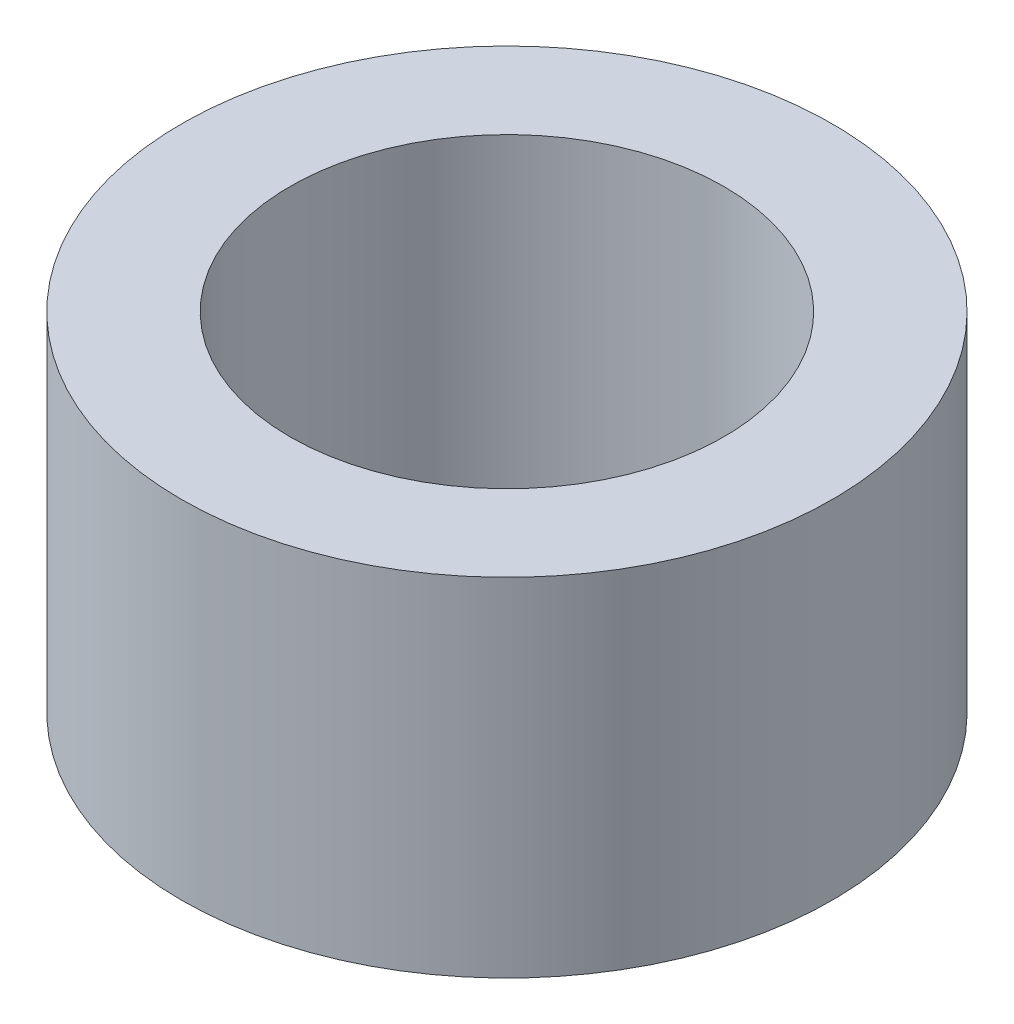
ISO-10303-21;
HEADER;
FILE_DESCRIPTION(('STEP AP214'),'2;1');
FILE_NAME('part.step','',(''),(''),'','','');
FILE_SCHEMA(('AUTOMOTIVE_DESIGN { 1 0 10303 214 1 1 1 1 }'));
ENDSEC;
DATA;
#1=APPLICATION_CONTEXT('core data for automotive mechanical design processes');
#2=APPLICATION_PROTOCOL_DEFINITION('international standard','automotive_design',2000,#1);
#3=PRODUCT_CONTEXT('',#1,'mechanical');
#4=PRODUCT('Part','Part','',(#3));
#5=PRODUCT_RELATED_PRODUCT_CATEGORY('part','',(#4));
#6=PRODUCT_DEFINITION_FORMATION('','',#4);
#7=PRODUCT_DEFINITION_CONTEXT('part definition',#1,'design');
#8=PRODUCT_DEFINITION('design','',#6,#7);
#9=PRODUCT_DEFINITION_SHAPE('','',#8);
#10=(LENGTH_UNIT() NAMED_UNIT(*) SI_UNIT(.MILLI.,.METRE.));
#11=(NAMED_UNIT(*) PLANE_ANGLE_UNIT() SI_UNIT($,.RADIAN.));
#12=(NAMED_UNIT(*) SI_UNIT($,.STERADIAN.) SOLID_ANGLE_UNIT());
#13=UNCERTAINTY_MEASURE_WITH_UNIT(LENGTH_MEASURE(1.E-05),#10,'distance_accuracy_value','');
#14=(GEOMETRIC_REPRESENTATION_CONTEXT(3) GLOBAL_UNCERTAINTY_ASSIGNED_CONTEXT((#13)) GLOBAL_UNIT_ASSIGNED_CONTEXT((#10,
#11,#12)) REPRESENTATION_CONTEXT('',''));
#15=CARTESIAN_POINT('',(0.,0.,0.));
#16=DIRECTION('',(0.,0.,1.));
#17=DIRECTION('',(1.,0.,0.));
#18=AXIS2_PLACEMENT_3D('',#15,#16,#17);
#19=CARTESIAN_POINT('',(0.,8.,0.));
#20=DIRECTION('',(0.,1.,0.));
#21=DIRECTION('',(0.,0.,1.));
#22=AXIS2_PLACEMENT_3D('',#19,#20,#21);
#23=PLANE('',#22);
#24=CARTESIAN_POINT('',(0.,8.,0.));
#25=DIRECTION('',(0.,1.,0.));
#26=DIRECTION('',(0.,0.,1.));
#27=AXIS2_PLACEMENT_3D('',#24,#25,#26);
#28=CIRCLE('',#27,7.5);
#29=CARTESIAN_POINT('',(0.,8.,7.5));
#30=VERTEX_POINT('',#29);
#31=EDGE_CURVE('E10',#30,#30,#28,.T.);
#32=ORIENTED_EDGE('',*,*,#31,.T.);
#33=EDGE_LOOP('',(#32));
#34=FACE_BOUND('',#33,.T.);
#35=CARTESIAN_POINT('',(0.,8.,0.));
#36=DIRECTION('',(0.,1.,0.));
#37=DIRECTION('',(0.,0.,1.));
#38=AXIS2_PLACEMENT_3D('',#35,#36,#37);
#39=CIRCLE('',#38,5.);
#40=CARTESIAN_POINT('',(0.,8.,5.));
#41=VERTEX_POINT('',#40);
#42=EDGE_CURVE('E50',#41,#41,#39,.T.);
#43=ORIENTED_EDGE('',*,*,#42,.F.);
#44=EDGE_LOOP('',(#43));
#45=FACE_BOUND('',#44,.T.);
#46=ADVANCED_FACE('F37',(#34,#45),#23,.T.);
#47=CARTESIAN_POINT('',(0.,0.,0.));
#48=DIRECTION('',(0.,1.,0.));
#49=DIRECTION('',(0.,0.,1.));
#50=AXIS2_PLACEMENT_3D('',#47,#48,#49);
#51=PLANE('',#50);
#52=CARTESIAN_POINT('',(0.,0.,0.));
#53=DIRECTION('',(0.,1.,0.));
#54=DIRECTION('',(0.,0.,1.));
#55=AXIS2_PLACEMENT_3D('',#52,#53,#54);
#56=CIRCLE('',#55,7.5);
#57=CARTESIAN_POINT('',(0.,0.,7.5));
#58=VERTEX_POINT('',#57);
#59=EDGE_CURVE('E41',#58,#58,#56,.T.);
#60=ORIENTED_EDGE('',*,*,#59,.F.);
#61=EDGE_LOOP('',(#60));
#62=FACE_BOUND('',#61,.T.);
#63=CARTESIAN_POINT('',(0.,0.,0.));
#64=DIRECTION('',(0.,1.,0.));
#65=DIRECTION('',(0.,0.,1.));
#66=AXIS2_PLACEMENT_3D('',#63,#64,#65);
#67=CIRCLE('',#66,5.);
#68=CARTESIAN_POINT('',(0.,0.,5.));
#69=VERTEX_POINT('',#68);
#70=EDGE_CURVE('E52',#69,#69,#67,.T.);
#71=ORIENTED_EDGE('',*,*,#70,.T.);
#72=EDGE_LOOP('',(#71));
#73=FACE_BOUND('',#72,.T.);
#74=ADVANCED_FACE('F64',(#62,#73),#51,.F.);
#75=CARTESIAN_POINT('',(0.,8.,0.));
#76=DIRECTION('',(0.,-1.,0.));
#77=DIRECTION('',(0.,0.,-1.));
#78=AXIS2_PLACEMENT_3D('',#75,#76,#77);
#79=CYLINDRICAL_SURFACE('',#78,7.5);
#80=ORIENTED_EDGE('',*,*,#31,.F.);
#81=EDGE_LOOP('',(#80));
#82=FACE_BOUND('',#81,.T.);
#83=ORIENTED_EDGE('',*,*,#59,.T.);
#84=EDGE_LOOP('',(#83));
#85=FACE_BOUND('',#84,.T.);
#86=ADVANCED_FACE('F39',(#82,#85),#79,.T.);
#87=CARTESIAN_POINT('',(0.,8.,0.));
#88=DIRECTION('',(0.,-1.,0.));
#89=DIRECTION('',(0.,0.,-1.));
#90=AXIS2_PLACEMENT_3D('',#87,#88,#89);
#91=CYLINDRICAL_SURFACE('',#90,5.);
#92=ORIENTED_EDGE('',*,*,#42,.T.);
#93=EDGE_LOOP('',(#92));
#94=FACE_BOUND('',#93,.T.);
#95=ORIENTED_EDGE('',*,*,#70,.F.);
#96=EDGE_LOOP('',(#95));
#97=FACE_BOUND('',#96,.T.);
#98=ADVANCED_FACE('F60',(#94,#97),#91,.F.);
#99=CLOSED_SHELL('',(#46,#74,#86,#98));
#100=MANIFOLD_SOLID_BREP('B2',#99);
#101=ADVANCED_BREP_SHAPE_REPRESENTATION('',(#18,#100),#14);
#102=SHAPE_DEFINITION_REPRESENTATION(#9,#101);
ENDSEC;
END-ISO-10303-21;
